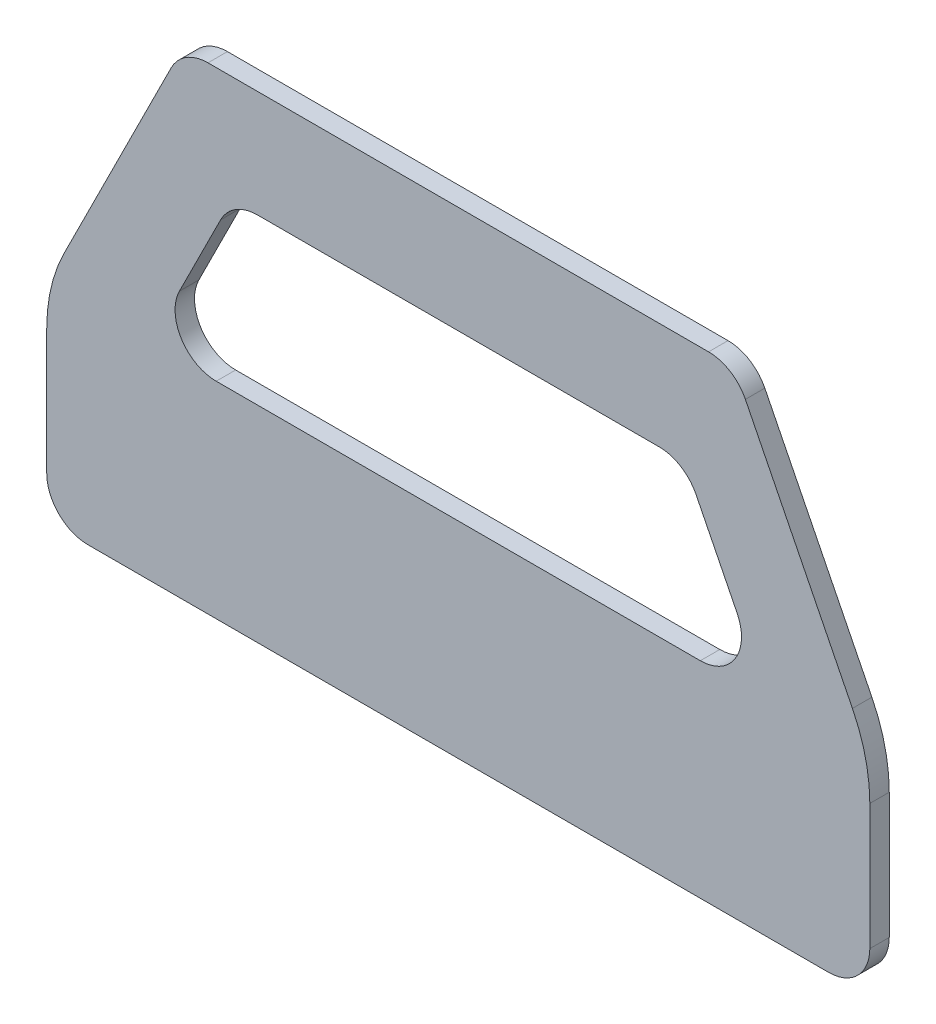
ISO-10303-21;
HEADER;
FILE_DESCRIPTION(('STEP AP214'),'2;1');
FILE_NAME('part.step','',(''),(''),'','','');
FILE_SCHEMA(('AUTOMOTIVE_DESIGN { 1 0 10303 214 1 1 1 1 }'));
ENDSEC;
DATA;
#1=APPLICATION_CONTEXT('core data for automotive mechanical design processes');
#2=APPLICATION_PROTOCOL_DEFINITION('international standard','automotive_design',2000,#1);
#3=PRODUCT_CONTEXT('',#1,'mechanical');
#4=PRODUCT('Part','Part','',(#3));
#5=PRODUCT_RELATED_PRODUCT_CATEGORY('part','',(#4));
#6=PRODUCT_DEFINITION_FORMATION('','',#4);
#7=PRODUCT_DEFINITION_CONTEXT('part definition',#1,'design');
#8=PRODUCT_DEFINITION('design','',#6,#7);
#9=PRODUCT_DEFINITION_SHAPE('','',#8);
#10=(LENGTH_UNIT() NAMED_UNIT(*) SI_UNIT(.MILLI.,.METRE.));
#11=(NAMED_UNIT(*) PLANE_ANGLE_UNIT() SI_UNIT($,.RADIAN.));
#12=(NAMED_UNIT(*) SI_UNIT($,.STERADIAN.) SOLID_ANGLE_UNIT());
#13=UNCERTAINTY_MEASURE_WITH_UNIT(LENGTH_MEASURE(1.E-05),#10,'distance_accuracy_value','');
#14=(GEOMETRIC_REPRESENTATION_CONTEXT(3) GLOBAL_UNCERTAINTY_ASSIGNED_CONTEXT((#13)) GLOBAL_UNIT_ASSIGNED_CONTEXT((#10,
#11,#12)) REPRESENTATION_CONTEXT('',''));
#15=CARTESIAN_POINT('',(0.,0.,0.));
#16=DIRECTION('',(0.,0.,1.));
#17=DIRECTION('',(1.,0.,0.));
#18=AXIS2_PLACEMENT_3D('',#15,#16,#17);
#19=CARTESIAN_POINT('',(0.,0.,6.));
#20=DIRECTION('',(-0.894427190999916,0.447213595499958,0.));
#21=DIRECTION('',(-0.447213595499958,-0.894427190999916,0.));
#22=AXIS2_PLACEMENT_3D('',#19,#20,#21);
#23=PLANE('',#22);
#24=DIRECTION('',(0.447213595499958,0.894427190999916,0.));
#25=VECTOR('',#24,1.);
#26=CARTESIAN_POINT('',(0.,0.,0.));
#27=LINE('',#26,#25);
#28=CARTESIAN_POINT('',(40.9398063314248,81.8796126628496,0.));
#29=VERTEX_POINT('',#28);
#30=CARTESIAN_POINT('',(53.6398063314247,107.279612662849,0.));
#31=VERTEX_POINT('',#30);
#32=EDGE_CURVE('E265',#29,#31,#27,.T.);
#33=ORIENTED_EDGE('',*,*,#32,.T.);
#34=DIRECTION('',(0.,0.,-1.));
#35=VECTOR('',#34,1.);
#36=CARTESIAN_POINT('',(53.6398063314247,107.279612662849,6.));
#37=LINE('',#36,#35);
#38=CARTESIAN_POINT('',(53.6398063314247,107.279612662849,6.));
#39=VERTEX_POINT('',#38);
#40=EDGE_CURVE('E11',#39,#31,#37,.T.);
#41=ORIENTED_EDGE('',*,*,#40,.F.);
#42=DIRECTION('',(0.447213595499958,0.894427190999916,0.));
#43=VECTOR('',#42,1.);
#44=CARTESIAN_POINT('',(0.,0.,6.));
#45=LINE('',#44,#43);
#46=CARTESIAN_POINT('',(40.9398063314248,81.8796126628496,6.));
#47=VERTEX_POINT('',#46);
#48=EDGE_CURVE('E435',#47,#39,#45,.T.);
#49=ORIENTED_EDGE('',*,*,#48,.F.);
#50=DIRECTION('',(0.,0.,-1.));
#51=VECTOR('',#50,1.);
#52=CARTESIAN_POINT('',(40.9398063314248,81.8796126628496,6.));
#53=LINE('',#52,#51);
#54=EDGE_CURVE('E61',#47,#29,#53,.T.);
#55=ORIENTED_EDGE('',*,*,#54,.T.);
#56=EDGE_LOOP('',(#33,#41,#49,#55));
#57=FACE_BOUND('',#56,.T.);
#58=ADVANCED_FACE('F41',(#57),#23,.F.);
#59=CARTESIAN_POINT('',(64.9990316571237,101.6,6.));
#60=DIRECTION('',(0.,0.,-1.));
#61=DIRECTION('',(-1.,0.,0.));
#62=AXIS2_PLACEMENT_3D('',#59,#60,#61);
#63=CYLINDRICAL_SURFACE('',#62,12.7);
#64=CARTESIAN_POINT('',(64.9990316571237,101.6,0.));
#65=DIRECTION('',(0.,0.,1.));
#66=DIRECTION('',(1.,0.,0.));
#67=AXIS2_PLACEMENT_3D('',#64,#65,#66);
#68=CIRCLE('',#67,12.7);
#69=CARTESIAN_POINT('',(64.9990316571237,114.3,0.));
#70=VERTEX_POINT('',#69);
#71=EDGE_CURVE('E268',#31,#70,#68,.F.);
#72=ORIENTED_EDGE('',*,*,#71,.T.);
#73=DIRECTION('',(0.,0.,-1.));
#74=VECTOR('',#73,1.);
#75=CARTESIAN_POINT('',(64.9990316571237,114.3,6.));
#76=LINE('',#75,#74);
#77=CARTESIAN_POINT('',(64.9990316571237,114.3,6.));
#78=VERTEX_POINT('',#77);
#79=EDGE_CURVE('E52',#78,#70,#76,.T.);
#80=ORIENTED_EDGE('',*,*,#79,.F.);
#81=CARTESIAN_POINT('',(64.9990316571237,101.6,6.));
#82=DIRECTION('',(0.,0.,1.));
#83=DIRECTION('',(1.,0.,0.));
#84=AXIS2_PLACEMENT_3D('',#81,#82,#83);
#85=CIRCLE('',#84,12.7);
#86=EDGE_CURVE('E438',#39,#78,#85,.F.);
#87=ORIENTED_EDGE('',*,*,#86,.F.);
#88=ORIENTED_EDGE('',*,*,#40,.T.);
#89=EDGE_LOOP('',(#72,#80,#87,#88));
#90=FACE_BOUND('',#89,.T.);
#91=ADVANCED_FACE('F464',(#90),#63,.F.);
#92=CARTESIAN_POINT('',(0.,114.3,6.));
#93=DIRECTION('',(0.,1.,0.));
#94=DIRECTION('',(0.,0.,1.));
#95=AXIS2_PLACEMENT_3D('',#92,#93,#94);
#96=PLANE('',#95);
#97=DIRECTION('',(1.,0.,0.));
#98=VECTOR('',#97,1.);
#99=CARTESIAN_POINT('',(0.,114.3,0.));
#100=LINE('',#99,#98);
#101=CARTESIAN_POINT('',(189.000968342876,114.3,0.));
#102=VERTEX_POINT('',#101);
#103=EDGE_CURVE('E271',#70,#102,#100,.T.);
#104=ORIENTED_EDGE('',*,*,#103,.T.);
#105=DIRECTION('',(0.,0.,-1.));
#106=VECTOR('',#105,1.);
#107=CARTESIAN_POINT('',(189.000968342876,114.3,6.));
#108=LINE('',#107,#106);
#109=CARTESIAN_POINT('',(189.000968342876,114.3,6.));
#110=VERTEX_POINT('',#109);
#111=EDGE_CURVE('E301',#110,#102,#108,.T.);
#112=ORIENTED_EDGE('',*,*,#111,.F.);
#113=DIRECTION('',(1.,0.,0.));
#114=VECTOR('',#113,1.);
#115=CARTESIAN_POINT('',(0.,114.3,6.));
#116=LINE('',#115,#114);
#117=EDGE_CURVE('E441',#78,#110,#116,.T.);
#118=ORIENTED_EDGE('',*,*,#117,.F.);
#119=ORIENTED_EDGE('',*,*,#79,.T.);
#120=EDGE_LOOP('',(#104,#112,#118,#119));
#121=FACE_BOUND('',#120,.T.);
#122=ADVANCED_FACE('F469',(#121),#96,.F.);
#123=CARTESIAN_POINT('',(189.000968342876,101.6,6.));
#124=DIRECTION('',(0.,0.,-1.));
#125=DIRECTION('',(-1.,0.,0.));
#126=AXIS2_PLACEMENT_3D('',#123,#124,#125);
#127=CYLINDRICAL_SURFACE('',#126,12.7);
#128=CARTESIAN_POINT('',(189.000968342876,101.6,0.));
#129=DIRECTION('',(0.,0.,1.));
#130=DIRECTION('',(1.,0.,0.));
#131=AXIS2_PLACEMENT_3D('',#128,#129,#130);
#132=CIRCLE('',#131,12.7);
#133=CARTESIAN_POINT('',(200.360193668575,107.279612662849,0.));
#134=VERTEX_POINT('',#133);
#135=EDGE_CURVE('E274',#102,#134,#132,.F.);
#136=ORIENTED_EDGE('',*,*,#135,.T.);
#137=DIRECTION('',(0.,0.,-1.));
#138=VECTOR('',#137,1.);
#139=CARTESIAN_POINT('',(200.360193668575,107.279612662849,6.));
#140=LINE('',#139,#138);
#141=CARTESIAN_POINT('',(200.360193668575,107.279612662849,6.));
#142=VERTEX_POINT('',#141);
#143=EDGE_CURVE('E298',#142,#134,#140,.T.);
#144=ORIENTED_EDGE('',*,*,#143,.F.);
#145=CARTESIAN_POINT('',(189.000968342876,101.6,6.));
#146=DIRECTION('',(0.,0.,1.));
#147=DIRECTION('',(1.,0.,0.));
#148=AXIS2_PLACEMENT_3D('',#145,#146,#147);
#149=CIRCLE('',#148,12.7);
#150=EDGE_CURVE('E444',#110,#142,#149,.F.);
#151=ORIENTED_EDGE('',*,*,#150,.F.);
#152=ORIENTED_EDGE('',*,*,#111,.T.);
#153=EDGE_LOOP('',(#136,#144,#151,#152));
#154=FACE_BOUND('',#153,.T.);
#155=ADVANCED_FACE('F505',(#154),#127,.F.);
#156=CARTESIAN_POINT('',(203.2,101.6,6.));
#157=DIRECTION('',(-0.894427190999916,-0.447213595499958,0.));
#158=DIRECTION('',(0.447213595499958,-0.894427190999916,0.));
#159=AXIS2_PLACEMENT_3D('',#156,#157,#158);
#160=PLANE('',#159);
#161=DIRECTION('',(-0.447213595499958,0.894427190999916,0.));
#162=VECTOR('',#161,1.);
#163=CARTESIAN_POINT('',(203.2,101.6,0.));
#164=LINE('',#163,#162);
#165=CARTESIAN_POINT('',(213.060193668575,81.8796126628496,0.));
#166=VERTEX_POINT('',#165);
#167=EDGE_CURVE('E278',#166,#134,#164,.T.);
#168=ORIENTED_EDGE('',*,*,#167,.F.);
#169=DIRECTION('',(0.,0.,-1.));
#170=VECTOR('',#169,1.);
#171=CARTESIAN_POINT('',(213.060193668575,81.8796126628496,6.));
#172=LINE('',#171,#170);
#173=CARTESIAN_POINT('',(213.060193668575,81.8796126628496,6.));
#174=VERTEX_POINT('',#173);
#175=EDGE_CURVE('E208',#174,#166,#172,.T.);
#176=ORIENTED_EDGE('',*,*,#175,.F.);
#177=DIRECTION('',(-0.447213595499958,0.894427190999916,0.));
#178=VECTOR('',#177,1.);
#179=CARTESIAN_POINT('',(203.2,101.6,6.));
#180=LINE('',#179,#178);
#181=EDGE_CURVE('E196',#174,#142,#180,.T.);
#182=ORIENTED_EDGE('',*,*,#181,.T.);
#183=ORIENTED_EDGE('',*,*,#143,.T.);
#184=EDGE_LOOP('',(#168,#176,#182,#183));
#185=FACE_BOUND('',#184,.T.);
#186=ADVANCED_FACE('F449',(#185),#160,.T.);
#187=CARTESIAN_POINT('',(201.700968342876,76.2,6.));
#188=DIRECTION('',(0.,0.,-1.));
#189=DIRECTION('',(-1.,0.,0.));
#190=AXIS2_PLACEMENT_3D('',#187,#188,#189);
#191=CYLINDRICAL_SURFACE('',#190,12.7);
#192=CARTESIAN_POINT('',(201.700968342876,76.2,0.));
#193=DIRECTION('',(0.,0.,1.));
#194=DIRECTION('',(1.,0.,0.));
#195=AXIS2_PLACEMENT_3D('',#192,#193,#194);
#196=CIRCLE('',#195,12.7);
#197=CARTESIAN_POINT('',(201.700968342876,63.5,0.));
#198=VERTEX_POINT('',#197);
#199=EDGE_CURVE('E204',#166,#198,#196,.F.);
#200=ORIENTED_EDGE('',*,*,#199,.T.);
#201=DIRECTION('',(0.,0.,-1.));
#202=VECTOR('',#201,1.);
#203=CARTESIAN_POINT('',(201.700968342876,63.5,6.));
#204=LINE('',#203,#202);
#205=CARTESIAN_POINT('',(201.700968342876,63.5,6.));
#206=VERTEX_POINT('',#205);
#207=EDGE_CURVE('E201',#206,#198,#204,.T.);
#208=ORIENTED_EDGE('',*,*,#207,.F.);
#209=CARTESIAN_POINT('',(201.700968342876,76.2,6.));
#210=DIRECTION('',(0.,0.,1.));
#211=DIRECTION('',(1.,0.,0.));
#212=AXIS2_PLACEMENT_3D('',#209,#210,#211);
#213=CIRCLE('',#212,12.7);
#214=EDGE_CURVE('E188',#174,#206,#213,.F.);
#215=ORIENTED_EDGE('',*,*,#214,.F.);
#216=ORIENTED_EDGE('',*,*,#175,.T.);
#217=EDGE_LOOP('',(#200,#208,#215,#216));
#218=FACE_BOUND('',#217,.T.);
#219=ADVANCED_FACE('F202',(#218),#191,.F.);
#220=CARTESIAN_POINT('',(0.,63.5,6.));
#221=DIRECTION('',(0.,1.,0.));
#222=DIRECTION('',(0.,0.,1.));
#223=AXIS2_PLACEMENT_3D('',#220,#221,#222);
#224=PLANE('',#223);
#225=DIRECTION('',(1.,0.,0.));
#226=VECTOR('',#225,1.);
#227=CARTESIAN_POINT('',(0.,63.5,0.));
#228=LINE('',#227,#226);
#229=CARTESIAN_POINT('',(52.2990316571238,63.5,0.));
#230=VERTEX_POINT('',#229);
#231=EDGE_CURVE('E284',#230,#198,#228,.T.);
#232=ORIENTED_EDGE('',*,*,#231,.F.);
#233=DIRECTION('',(0.,0.,-1.));
#234=VECTOR('',#233,1.);
#235=CARTESIAN_POINT('',(52.2990316571238,63.5,6.));
#236=LINE('',#235,#234);
#237=CARTESIAN_POINT('',(52.2990316571238,63.5,6.));
#238=VERTEX_POINT('',#237);
#239=EDGE_CURVE('E123',#238,#230,#236,.T.);
#240=ORIENTED_EDGE('',*,*,#239,.F.);
#241=DIRECTION('',(1.,0.,0.));
#242=VECTOR('',#241,1.);
#243=CARTESIAN_POINT('',(0.,63.5,6.));
#244=LINE('',#243,#242);
#245=EDGE_CURVE('E194',#238,#206,#244,.T.);
#246=ORIENTED_EDGE('',*,*,#245,.T.);
#247=ORIENTED_EDGE('',*,*,#207,.T.);
#248=EDGE_LOOP('',(#232,#240,#246,#247));
#249=FACE_BOUND('',#248,.T.);
#250=ADVANCED_FACE('F210',(#249),#224,.T.);
#251=CARTESIAN_POINT('',(12.7,12.7,6.));
#252=DIRECTION('',(0.,0.,-1.));
#253=DIRECTION('',(-1.,0.,0.));
#254=AXIS2_PLACEMENT_3D('',#251,#252,#253);
#255=CYLINDRICAL_SURFACE('',#254,12.7);
#256=CARTESIAN_POINT('',(12.7,12.7,0.));
#257=DIRECTION('',(0.,0.,1.));
#258=DIRECTION('',(1.,0.,0.));
#259=AXIS2_PLACEMENT_3D('',#256,#257,#258);
#260=CIRCLE('',#259,12.7);
#261=CARTESIAN_POINT('',(12.7000000000001,0.,0.));
#262=VERTEX_POINT('',#261);
#263=CARTESIAN_POINT('',(0.,12.7000000000001,0.));
#264=VERTEX_POINT('',#263);
#265=EDGE_CURVE('E219',#262,#264,#260,.F.);
#266=ORIENTED_EDGE('',*,*,#265,.F.);
#267=DIRECTION('',(0.,0.,-1.));
#268=VECTOR('',#267,1.);
#269=CARTESIAN_POINT('',(12.7000000000001,0.,6.));
#270=LINE('',#269,#268);
#271=CARTESIAN_POINT('',(12.7000000000001,0.,6.));
#272=VERTEX_POINT('',#271);
#273=EDGE_CURVE('E45',#272,#262,#270,.T.);
#274=ORIENTED_EDGE('',*,*,#273,.F.);
#275=CARTESIAN_POINT('',(12.7,12.7,6.));
#276=DIRECTION('',(0.,0.,1.));
#277=DIRECTION('',(1.,0.,0.));
#278=AXIS2_PLACEMENT_3D('',#275,#276,#277);
#279=CIRCLE('',#278,12.7);
#280=CARTESIAN_POINT('',(0.,12.7000000000001,6.));
#281=VERTEX_POINT('',#280);
#282=EDGE_CURVE('E291',#272,#281,#279,.F.);
#283=ORIENTED_EDGE('',*,*,#282,.T.);
#284=DIRECTION('',(0.,0.,-1.));
#285=VECTOR('',#284,1.);
#286=CARTESIAN_POINT('',(0.,12.7000000000001,6.));
#287=LINE('',#286,#285);
#288=EDGE_CURVE('E215',#281,#264,#287,.T.);
#289=ORIENTED_EDGE('',*,*,#288,.T.);
#290=EDGE_LOOP('',(#266,#274,#283,#289));
#291=FACE_BOUND('',#290,.T.);
#292=ADVANCED_FACE('F43',(#291),#255,.T.);
#293=CARTESIAN_POINT('',(0.,0.,6.));
#294=DIRECTION('',(0.,1.,0.));
#295=DIRECTION('',(0.,0.,1.));
#296=AXIS2_PLACEMENT_3D('',#293,#294,#295);
#297=PLANE('',#296);
#298=DIRECTION('',(1.,0.,0.));
#299=VECTOR('',#298,1.);
#300=CARTESIAN_POINT('',(0.,0.,0.));
#301=LINE('',#300,#299);
#302=CARTESIAN_POINT('',(241.3,0.,0.));
#303=VERTEX_POINT('',#302);
#304=EDGE_CURVE('E223',#262,#303,#301,.T.);
#305=ORIENTED_EDGE('',*,*,#304,.T.);
#306=DIRECTION('',(0.,0.,-1.));
#307=VECTOR('',#306,1.);
#308=CARTESIAN_POINT('',(241.3,0.,6.));
#309=LINE('',#308,#307);
#310=CARTESIAN_POINT('',(241.3,0.,6.));
#311=VERTEX_POINT('',#310);
#312=EDGE_CURVE('E337',#311,#303,#309,.T.);
#313=ORIENTED_EDGE('',*,*,#312,.F.);
#314=DIRECTION('',(1.,0.,0.));
#315=VECTOR('',#314,1.);
#316=CARTESIAN_POINT('',(0.,0.,6.));
#317=LINE('',#316,#315);
#318=EDGE_CURVE('E348',#272,#311,#317,.T.);
#319=ORIENTED_EDGE('',*,*,#318,.F.);
#320=ORIENTED_EDGE('',*,*,#273,.T.);
#321=EDGE_LOOP('',(#305,#313,#319,#320));
#322=FACE_BOUND('',#321,.T.);
#323=ADVANCED_FACE('F347',(#322),#297,.F.);
#324=CARTESIAN_POINT('',(241.3,12.7,6.));
#325=DIRECTION('',(0.,0.,-1.));
#326=DIRECTION('',(-1.,0.,0.));
#327=AXIS2_PLACEMENT_3D('',#324,#325,#326);
#328=CYLINDRICAL_SURFACE('',#327,12.7);
#329=CARTESIAN_POINT('',(241.3,12.7,0.));
#330=DIRECTION('',(0.,0.,1.));
#331=DIRECTION('',(1.,0.,0.));
#332=AXIS2_PLACEMENT_3D('',#329,#330,#331);
#333=CIRCLE('',#332,12.7);
#334=CARTESIAN_POINT('',(254.,12.7000000000001,0.));
#335=VERTEX_POINT('',#334);
#336=EDGE_CURVE('E226',#303,#335,#333,.T.);
#337=ORIENTED_EDGE('',*,*,#336,.T.);
#338=DIRECTION('',(0.,0.,-1.));
#339=VECTOR('',#338,1.);
#340=CARTESIAN_POINT('',(254.,12.7000000000001,6.));
#341=LINE('',#340,#339);
#342=CARTESIAN_POINT('',(254.,12.7000000000001,6.));
#343=VERTEX_POINT('',#342);
#344=EDGE_CURVE('E334',#343,#335,#341,.T.);
#345=ORIENTED_EDGE('',*,*,#344,.F.);
#346=CARTESIAN_POINT('',(241.3,12.7,6.));
#347=DIRECTION('',(0.,0.,1.));
#348=DIRECTION('',(1.,0.,0.));
#349=AXIS2_PLACEMENT_3D('',#346,#347,#348);
#350=CIRCLE('',#349,12.7);
#351=EDGE_CURVE('E407',#311,#343,#350,.T.);
#352=ORIENTED_EDGE('',*,*,#351,.F.);
#353=ORIENTED_EDGE('',*,*,#312,.T.);
#354=EDGE_LOOP('',(#337,#345,#352,#353));
#355=FACE_BOUND('',#354,.T.);
#356=ADVANCED_FACE('F406',(#355),#328,.T.);
#357=CARTESIAN_POINT('',(254.,0.,6.));
#358=DIRECTION('',(-1.,0.,0.));
#359=DIRECTION('',(0.,0.,1.));
#360=AXIS2_PLACEMENT_3D('',#357,#358,#359);
#361=PLANE('',#360);
#362=DIRECTION('',(0.,1.,0.));
#363=VECTOR('',#362,1.);
#364=CARTESIAN_POINT('',(254.,0.,0.));
#365=LINE('',#364,#363);
#366=CARTESIAN_POINT('',(254.,51.5077467430105,0.));
#367=VERTEX_POINT('',#366);
#368=EDGE_CURVE('E229',#335,#367,#365,.T.);
#369=ORIENTED_EDGE('',*,*,#368,.T.);
#370=DIRECTION('',(0.,0.,-1.));
#371=VECTOR('',#370,1.);
#372=CARTESIAN_POINT('',(254.,51.5077467430105,6.));
#373=LINE('',#372,#371);
#374=CARTESIAN_POINT('',(254.,51.5077467430105,6.));
#375=VERTEX_POINT('',#374);
#376=EDGE_CURVE('E331',#375,#367,#373,.T.);
#377=ORIENTED_EDGE('',*,*,#376,.F.);
#378=DIRECTION('',(0.,1.,0.));
#379=VECTOR('',#378,1.);
#380=CARTESIAN_POINT('',(254.,0.,6.));
#381=LINE('',#380,#379);
#382=EDGE_CURVE('E405',#343,#375,#381,.T.);
#383=ORIENTED_EDGE('',*,*,#382,.F.);
#384=ORIENTED_EDGE('',*,*,#344,.T.);
#385=EDGE_LOOP('',(#369,#377,#383,#384));
#386=FACE_BOUND('',#385,.T.);
#387=ADVANCED_FACE('F403',(#386),#361,.F.);
#388=CARTESIAN_POINT('',(203.2,51.5077467430107,6.));
#389=DIRECTION('',(0.,0.,-1.));
#390=DIRECTION('',(-1.,0.,0.));
#391=AXIS2_PLACEMENT_3D('',#388,#389,#390);
#392=CYLINDRICAL_SURFACE('',#391,50.8);
#393=CARTESIAN_POINT('',(203.2,51.5077467430107,0.));
#394=DIRECTION('',(0.,0.,1.));
#395=DIRECTION('',(1.,0.,0.));
#396=AXIS2_PLACEMENT_3D('',#393,#394,#395);
#397=CIRCLE('',#396,50.8);
#398=CARTESIAN_POINT('',(248.636901302796,74.2261973944087,0.));
#399=VERTEX_POINT('',#398);
#400=EDGE_CURVE('E233',#399,#367,#397,.F.);
#401=ORIENTED_EDGE('',*,*,#400,.F.);
#402=DIRECTION('',(0.,0.,-1.));
#403=VECTOR('',#402,1.);
#404=CARTESIAN_POINT('',(248.636901302796,74.2261973944087,6.));
#405=LINE('',#404,#403);
#406=CARTESIAN_POINT('',(248.636901302796,74.2261973944087,6.));
#407=VERTEX_POINT('',#406);
#408=EDGE_CURVE('E328',#407,#399,#405,.T.);
#409=ORIENTED_EDGE('',*,*,#408,.F.);
#410=CARTESIAN_POINT('',(203.2,51.5077467430107,6.));
#411=DIRECTION('',(0.,0.,1.));
#412=DIRECTION('',(1.,0.,0.));
#413=AXIS2_PLACEMENT_3D('',#410,#411,#412);
#414=CIRCLE('',#413,50.8);
#415=EDGE_CURVE('E400',#407,#375,#414,.F.);
#416=ORIENTED_EDGE('',*,*,#415,.T.);
#417=ORIENTED_EDGE('',*,*,#376,.T.);
#418=EDGE_LOOP('',(#401,#409,#416,#417));
#419=FACE_BOUND('',#418,.T.);
#420=ADVANCED_FACE('F396',(#419),#392,.T.);
#421=CARTESIAN_POINT('',(228.6,114.3,6.));
#422=DIRECTION('',(0.894427190999916,0.447213595499958,0.));
#423=DIRECTION('',(-0.447213595499958,0.894427190999916,0.));
#424=AXIS2_PLACEMENT_3D('',#421,#422,#423);
#425=PLANE('',#424);
#426=DIRECTION('',(0.447213595499958,-0.894427190999916,0.));
#427=VECTOR('',#426,1.);
#428=CARTESIAN_POINT('',(228.6,114.3,0.));
#429=LINE('',#428,#427);
#430=CARTESIAN_POINT('',(215.600193668575,140.299612662849,0.));
#431=VERTEX_POINT('',#430);
#432=EDGE_CURVE('E237',#431,#399,#429,.T.);
#433=ORIENTED_EDGE('',*,*,#432,.F.);
#434=DIRECTION('',(0.,0.,-1.));
#435=VECTOR('',#434,1.);
#436=CARTESIAN_POINT('',(215.600193668575,140.299612662849,6.));
#437=LINE('',#436,#435);
#438=CARTESIAN_POINT('',(215.600193668575,140.299612662849,6.));
#439=VERTEX_POINT('',#438);
#440=EDGE_CURVE('E325',#439,#431,#437,.T.);
#441=ORIENTED_EDGE('',*,*,#440,.F.);
#442=DIRECTION('',(0.447213595499958,-0.894427190999916,0.));
#443=VECTOR('',#442,1.);
#444=CARTESIAN_POINT('',(228.6,114.3,6.));
#445=LINE('',#444,#443);
#446=EDGE_CURVE('E419',#439,#407,#445,.T.);
#447=ORIENTED_EDGE('',*,*,#446,.T.);
#448=ORIENTED_EDGE('',*,*,#408,.T.);
#449=EDGE_LOOP('',(#433,#441,#447,#448));
#450=FACE_BOUND('',#449,.T.);
#451=ADVANCED_FACE('F393',(#450),#425,.T.);
#452=CARTESIAN_POINT('',(204.240968342876,134.62,6.));
#453=DIRECTION('',(0.,0.,-1.));
#454=DIRECTION('',(-1.,0.,0.));
#455=AXIS2_PLACEMENT_3D('',#452,#453,#454);
#456=CYLINDRICAL_SURFACE('',#455,12.7);
#457=CARTESIAN_POINT('',(204.240968342876,134.62,0.));
#458=DIRECTION('',(0.,0.,1.));
#459=DIRECTION('',(1.,0.,0.));
#460=AXIS2_PLACEMENT_3D('',#457,#458,#459);
#461=CIRCLE('',#460,12.7);
#462=CARTESIAN_POINT('',(204.240968342876,147.32,0.));
#463=VERTEX_POINT('',#462);
#464=EDGE_CURVE('E241',#463,#431,#461,.F.);
#465=ORIENTED_EDGE('',*,*,#464,.F.);
#466=DIRECTION('',(0.,0.,-1.));
#467=VECTOR('',#466,1.);
#468=CARTESIAN_POINT('',(204.240968342876,147.32,6.));
#469=LINE('',#468,#467);
#470=CARTESIAN_POINT('',(204.240968342876,147.32,6.));
#471=VERTEX_POINT('',#470);
#472=EDGE_CURVE('E322',#471,#463,#469,.T.);
#473=ORIENTED_EDGE('',*,*,#472,.F.);
#474=CARTESIAN_POINT('',(204.240968342876,134.62,6.));
#475=DIRECTION('',(0.,0.,1.));
#476=DIRECTION('',(1.,0.,0.));
#477=AXIS2_PLACEMENT_3D('',#474,#475,#476);
#478=CIRCLE('',#477,12.7);
#479=EDGE_CURVE('E389',#471,#439,#478,.F.);
#480=ORIENTED_EDGE('',*,*,#479,.T.);
#481=ORIENTED_EDGE('',*,*,#440,.T.);
#482=EDGE_LOOP('',(#465,#473,#480,#481));
#483=FACE_BOUND('',#482,.T.);
#484=ADVANCED_FACE('F387',(#483),#456,.T.);
#485=CARTESIAN_POINT('',(0.,147.32,6.));
#486=DIRECTION('',(0.,1.,0.));
#487=DIRECTION('',(0.,0.,1.));
#488=AXIS2_PLACEMENT_3D('',#485,#486,#487);
#489=PLANE('',#488);
#490=DIRECTION('',(1.,0.,0.));
#491=VECTOR('',#490,1.);
#492=CARTESIAN_POINT('',(0.,147.32,0.));
#493=LINE('',#492,#491);
#494=CARTESIAN_POINT('',(49.7590316571237,147.32,0.));
#495=VERTEX_POINT('',#494);
#496=EDGE_CURVE('E245',#495,#463,#493,.T.);
#497=ORIENTED_EDGE('',*,*,#496,.F.);
#498=DIRECTION('',(0.,0.,-1.));
#499=VECTOR('',#498,1.);
#500=CARTESIAN_POINT('',(49.7590316571237,147.32,6.));
#501=LINE('',#500,#499);
#502=CARTESIAN_POINT('',(49.7590316571237,147.32,6.));
#503=VERTEX_POINT('',#502);
#504=EDGE_CURVE('E319',#503,#495,#501,.T.);
#505=ORIENTED_EDGE('',*,*,#504,.F.);
#506=DIRECTION('',(1.,0.,0.));
#507=VECTOR('',#506,1.);
#508=CARTESIAN_POINT('',(0.,147.32,6.));
#509=LINE('',#508,#507);
#510=EDGE_CURVE('E383',#503,#471,#509,.T.);
#511=ORIENTED_EDGE('',*,*,#510,.T.);
#512=ORIENTED_EDGE('',*,*,#472,.T.);
#513=EDGE_LOOP('',(#497,#505,#511,#512));
#514=FACE_BOUND('',#513,.T.);
#515=ADVANCED_FACE('F380',(#514),#489,.T.);
#516=CARTESIAN_POINT('',(49.7590316571237,134.62,6.));
#517=DIRECTION('',(0.,0.,-1.));
#518=DIRECTION('',(-1.,0.,0.));
#519=AXIS2_PLACEMENT_3D('',#516,#517,#518);
#520=CYLINDRICAL_SURFACE('',#519,12.7);
#521=CARTESIAN_POINT('',(49.7590316571237,134.62,0.));
#522=DIRECTION('',(0.,0.,1.));
#523=DIRECTION('',(1.,0.,0.));
#524=AXIS2_PLACEMENT_3D('',#521,#522,#523);
#525=CIRCLE('',#524,12.7);
#526=CARTESIAN_POINT('',(38.3998063314247,140.299612662849,0.));
#527=VERTEX_POINT('',#526);
#528=EDGE_CURVE('E249',#527,#495,#525,.F.);
#529=ORIENTED_EDGE('',*,*,#528,.F.);
#530=DIRECTION('',(0.,0.,-1.));
#531=VECTOR('',#530,1.);
#532=CARTESIAN_POINT('',(38.3998063314247,140.299612662849,6.));
#533=LINE('',#532,#531);
#534=CARTESIAN_POINT('',(38.3998063314247,140.299612662849,6.));
#535=VERTEX_POINT('',#534);
#536=EDGE_CURVE('E316',#535,#527,#533,.T.);
#537=ORIENTED_EDGE('',*,*,#536,.F.);
#538=CARTESIAN_POINT('',(49.7590316571237,134.62,6.));
#539=DIRECTION('',(0.,0.,1.));
#540=DIRECTION('',(1.,0.,0.));
#541=AXIS2_PLACEMENT_3D('',#538,#539,#540);
#542=CIRCLE('',#541,12.7);
#543=EDGE_CURVE('E426',#535,#503,#542,.F.);
#544=ORIENTED_EDGE('',*,*,#543,.T.);
#545=ORIENTED_EDGE('',*,*,#504,.T.);
#546=EDGE_LOOP('',(#529,#537,#544,#545));
#547=FACE_BOUND('',#546,.T.);
#548=ADVANCED_FACE('F376',(#547),#520,.T.);
#549=CARTESIAN_POINT('',(-25.4,12.7,6.));
#550=DIRECTION('',(-0.894427190999916,0.447213595499958,0.));
#551=DIRECTION('',(-0.447213595499958,-0.894427190999916,0.));
#552=AXIS2_PLACEMENT_3D('',#549,#550,#551);
#553=PLANE('',#552);
#554=DIRECTION('',(0.447213595499958,0.894427190999916,0.));
#555=VECTOR('',#554,1.);
#556=CARTESIAN_POINT('',(-25.4,12.7,0.));
#557=LINE('',#556,#555);
#558=CARTESIAN_POINT('',(5.36309869720436,74.2261973944087,0.));
#559=VERTEX_POINT('',#558);
#560=EDGE_CURVE('E253',#559,#527,#557,.T.);
#561=ORIENTED_EDGE('',*,*,#560,.F.);
#562=DIRECTION('',(0.,0.,-1.));
#563=VECTOR('',#562,1.);
#564=CARTESIAN_POINT('',(5.36309869720436,74.2261973944087,6.));
#565=LINE('',#564,#563);
#566=CARTESIAN_POINT('',(5.36309869720436,74.2261973944087,6.));
#567=VERTEX_POINT('',#566);
#568=EDGE_CURVE('E313',#567,#559,#565,.T.);
#569=ORIENTED_EDGE('',*,*,#568,.F.);
#570=DIRECTION('',(0.447213595499958,0.894427190999916,0.));
#571=VECTOR('',#570,1.);
#572=CARTESIAN_POINT('',(-25.4,12.7,6.));
#573=LINE('',#572,#571);
#574=EDGE_CURVE('E372',#567,#535,#573,.T.);
#575=ORIENTED_EDGE('',*,*,#574,.T.);
#576=ORIENTED_EDGE('',*,*,#536,.T.);
#577=EDGE_LOOP('',(#561,#569,#575,#576));
#578=FACE_BOUND('',#577,.T.);
#579=ADVANCED_FACE('F370',(#578),#553,.T.);
#580=CARTESIAN_POINT('',(50.8,51.5077467430107,6.));
#581=DIRECTION('',(0.,0.,-1.));
#582=DIRECTION('',(-1.,0.,0.));
#583=AXIS2_PLACEMENT_3D('',#580,#581,#582);
#584=CYLINDRICAL_SURFACE('',#583,50.8);
#585=CARTESIAN_POINT('',(50.8,51.5077467430107,0.));
#586=DIRECTION('',(0.,0.,1.));
#587=DIRECTION('',(1.,0.,0.));
#588=AXIS2_PLACEMENT_3D('',#585,#586,#587);
#589=CIRCLE('',#588,50.8);
#590=CARTESIAN_POINT('',(0.,51.5077467430105,0.));
#591=VERTEX_POINT('',#590);
#592=EDGE_CURVE('E257',#591,#559,#589,.F.);
#593=ORIENTED_EDGE('',*,*,#592,.F.);
#594=DIRECTION('',(0.,0.,-1.));
#595=VECTOR('',#594,1.);
#596=CARTESIAN_POINT('',(0.,51.5077467430105,6.));
#597=LINE('',#596,#595);
#598=CARTESIAN_POINT('',(0.,51.5077467430105,6.));
#599=VERTEX_POINT('',#598);
#600=EDGE_CURVE('E310',#599,#591,#597,.T.);
#601=ORIENTED_EDGE('',*,*,#600,.F.);
#602=CARTESIAN_POINT('',(50.8,51.5077467430107,6.));
#603=DIRECTION('',(0.,0.,1.));
#604=DIRECTION('',(1.,0.,0.));
#605=AXIS2_PLACEMENT_3D('',#602,#603,#604);
#606=CIRCLE('',#605,50.8);
#607=EDGE_CURVE('E366',#599,#567,#606,.F.);
#608=ORIENTED_EDGE('',*,*,#607,.T.);
#609=ORIENTED_EDGE('',*,*,#568,.T.);
#610=EDGE_LOOP('',(#593,#601,#608,#609));
#611=FACE_BOUND('',#610,.T.);
#612=ADVANCED_FACE('F363',(#611),#584,.T.);
#613=CARTESIAN_POINT('',(0.,0.,6.));
#614=DIRECTION('',(-1.,0.,0.));
#615=DIRECTION('',(0.,0.,1.));
#616=AXIS2_PLACEMENT_3D('',#613,#614,#615);
#617=PLANE('',#616);
#618=DIRECTION('',(0.,1.,0.));
#619=VECTOR('',#618,1.);
#620=CARTESIAN_POINT('',(0.,0.,0.));
#621=LINE('',#620,#619);
#622=EDGE_CURVE('E261',#264,#591,#621,.T.);
#623=ORIENTED_EDGE('',*,*,#622,.F.);
#624=ORIENTED_EDGE('',*,*,#288,.F.);
#625=DIRECTION('',(0.,1.,0.));
#626=VECTOR('',#625,1.);
#627=CARTESIAN_POINT('',(0.,0.,6.));
#628=LINE('',#627,#626);
#629=EDGE_CURVE('E359',#281,#599,#628,.T.);
#630=ORIENTED_EDGE('',*,*,#629,.T.);
#631=ORIENTED_EDGE('',*,*,#600,.T.);
#632=EDGE_LOOP('',(#623,#624,#630,#631));
#633=FACE_BOUND('',#632,.T.);
#634=ADVANCED_FACE('F358',(#633),#617,.T.);
#635=CARTESIAN_POINT('',(52.2990316571237,76.2,6.));
#636=DIRECTION('',(0.,0.,-1.));
#637=DIRECTION('',(-1.,0.,0.));
#638=AXIS2_PLACEMENT_3D('',#635,#636,#637);
#639=CYLINDRICAL_SURFACE('',#638,12.7);
#640=CARTESIAN_POINT('',(52.2990316571237,76.2,0.));
#641=DIRECTION('',(0.,0.,1.));
#642=DIRECTION('',(1.,0.,0.));
#643=AXIS2_PLACEMENT_3D('',#640,#641,#642);
#644=CIRCLE('',#643,12.7);
#645=EDGE_CURVE('E287',#29,#230,#644,.T.);
#646=ORIENTED_EDGE('',*,*,#645,.F.);
#647=ORIENTED_EDGE('',*,*,#54,.F.);
#648=CARTESIAN_POINT('',(52.2990316571237,76.2,6.));
#649=DIRECTION('',(0.,0.,1.));
#650=DIRECTION('',(1.,0.,0.));
#651=AXIS2_PLACEMENT_3D('',#648,#649,#650);
#652=CIRCLE('',#651,12.7);
#653=EDGE_CURVE('E212',#47,#238,#652,.T.);
#654=ORIENTED_EDGE('',*,*,#653,.T.);
#655=ORIENTED_EDGE('',*,*,#239,.T.);
#656=EDGE_LOOP('',(#646,#647,#654,#655));
#657=FACE_BOUND('',#656,.T.);
#658=ADVANCED_FACE('F452',(#657),#639,.F.);
#659=CARTESIAN_POINT('',(0.,0.,6.));
#660=DIRECTION('',(0.,0.,1.));
#661=DIRECTION('',(1.,0.,0.));
#662=AXIS2_PLACEMENT_3D('',#659,#660,#661);
#663=PLANE('',#662);
#664=ORIENTED_EDGE('',*,*,#282,.F.);
#665=ORIENTED_EDGE('',*,*,#318,.T.);
#666=ORIENTED_EDGE('',*,*,#351,.T.);
#667=ORIENTED_EDGE('',*,*,#382,.T.);
#668=ORIENTED_EDGE('',*,*,#415,.F.);
#669=ORIENTED_EDGE('',*,*,#446,.F.);
#670=ORIENTED_EDGE('',*,*,#479,.F.);
#671=ORIENTED_EDGE('',*,*,#510,.F.);
#672=ORIENTED_EDGE('',*,*,#543,.F.);
#673=ORIENTED_EDGE('',*,*,#574,.F.);
#674=ORIENTED_EDGE('',*,*,#607,.F.);
#675=ORIENTED_EDGE('',*,*,#629,.F.);
#676=EDGE_LOOP('',(#664,#665,#666,#667,#668,#669,#670,#671,#672,#673,#674,#675));
#677=FACE_BOUND('',#676,.T.);
#678=ORIENTED_EDGE('',*,*,#48,.T.);
#679=ORIENTED_EDGE('',*,*,#86,.T.);
#680=ORIENTED_EDGE('',*,*,#117,.T.);
#681=ORIENTED_EDGE('',*,*,#150,.T.);
#682=ORIENTED_EDGE('',*,*,#181,.F.);
#683=ORIENTED_EDGE('',*,*,#214,.T.);
#684=ORIENTED_EDGE('',*,*,#245,.F.);
#685=ORIENTED_EDGE('',*,*,#653,.F.);
#686=EDGE_LOOP('',(#678,#679,#680,#681,#682,#683,#684,#685));
#687=FACE_BOUND('',#686,.T.);
#688=ADVANCED_FACE('F191',(#677,#687),#663,.T.);
#689=CARTESIAN_POINT('',(0.,0.,0.));
#690=DIRECTION('',(0.,0.,1.));
#691=DIRECTION('',(1.,0.,0.));
#692=AXIS2_PLACEMENT_3D('',#689,#690,#691);
#693=PLANE('',#692);
#694=ORIENTED_EDGE('',*,*,#265,.T.);
#695=ORIENTED_EDGE('',*,*,#622,.T.);
#696=ORIENTED_EDGE('',*,*,#592,.T.);
#697=ORIENTED_EDGE('',*,*,#560,.T.);
#698=ORIENTED_EDGE('',*,*,#528,.T.);
#699=ORIENTED_EDGE('',*,*,#496,.T.);
#700=ORIENTED_EDGE('',*,*,#464,.T.);
#701=ORIENTED_EDGE('',*,*,#432,.T.);
#702=ORIENTED_EDGE('',*,*,#400,.T.);
#703=ORIENTED_EDGE('',*,*,#368,.F.);
#704=ORIENTED_EDGE('',*,*,#336,.F.);
#705=ORIENTED_EDGE('',*,*,#304,.F.);
#706=EDGE_LOOP('',(#694,#695,#696,#697,#698,#699,#700,#701,#702,#703,#704,#705));
#707=FACE_BOUND('',#706,.T.);
#708=ORIENTED_EDGE('',*,*,#32,.F.);
#709=ORIENTED_EDGE('',*,*,#645,.T.);
#710=ORIENTED_EDGE('',*,*,#231,.T.);
#711=ORIENTED_EDGE('',*,*,#199,.F.);
#712=ORIENTED_EDGE('',*,*,#167,.T.);
#713=ORIENTED_EDGE('',*,*,#135,.F.);
#714=ORIENTED_EDGE('',*,*,#103,.F.);
#715=ORIENTED_EDGE('',*,*,#71,.F.);
#716=EDGE_LOOP('',(#708,#709,#710,#711,#712,#713,#714,#715));
#717=FACE_BOUND('',#716,.T.);
#718=ADVANCED_FACE('F351',(#707,#717),#693,.F.);
#719=CLOSED_SHELL('',(#58,#91,#122,#155,#186,#219,#250,#292,#323,#356,#387,#420,#451,#484,#515,
#548,#579,#612,#634,#658,#688,#718));
#720=MANIFOLD_SOLID_BREP('B2',#719);
#721=ADVANCED_BREP_SHAPE_REPRESENTATION('',(#18,#720),#14);
#722=SHAPE_DEFINITION_REPRESENTATION(#9,#721);
ENDSEC;
END-ISO-10303-21;
